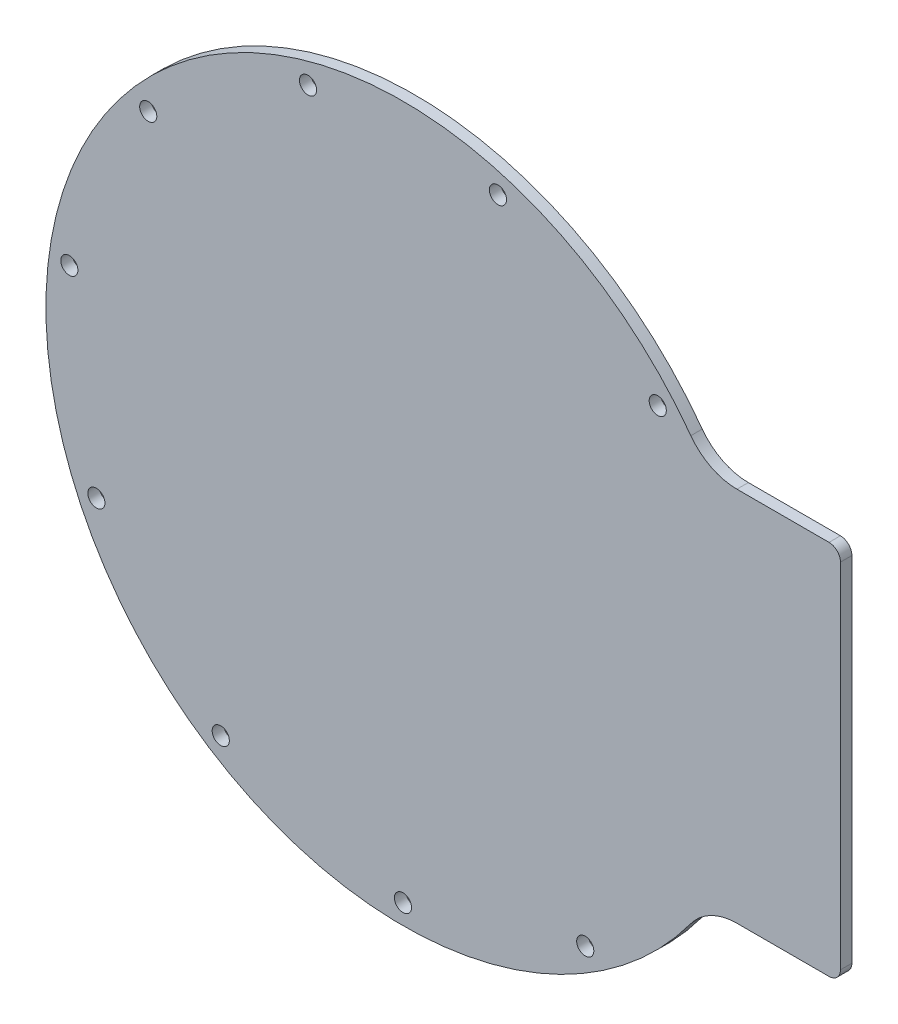
ISO-10303-21;
HEADER;
FILE_DESCRIPTION(('STEP AP214'),'2;1');
FILE_NAME('part.step','',(''),(''),'','','');
FILE_SCHEMA(('AUTOMOTIVE_DESIGN { 1 0 10303 214 1 1 1 1 }'));
ENDSEC;
DATA;
#1=APPLICATION_CONTEXT('core data for automotive mechanical design processes');
#2=APPLICATION_PROTOCOL_DEFINITION('international standard','automotive_design',2000,#1);
#3=PRODUCT_CONTEXT('',#1,'mechanical');
#4=PRODUCT('Part','Part','',(#3));
#5=PRODUCT_RELATED_PRODUCT_CATEGORY('part','',(#4));
#6=PRODUCT_DEFINITION_FORMATION('','',#4);
#7=PRODUCT_DEFINITION_CONTEXT('part definition',#1,'design');
#8=PRODUCT_DEFINITION('design','',#6,#7);
#9=PRODUCT_DEFINITION_SHAPE('','',#8);
#10=(LENGTH_UNIT() NAMED_UNIT(*) SI_UNIT(.MILLI.,.METRE.));
#11=(NAMED_UNIT(*) PLANE_ANGLE_UNIT() SI_UNIT($,.RADIAN.));
#12=(NAMED_UNIT(*) SI_UNIT($,.STERADIAN.) SOLID_ANGLE_UNIT());
#13=UNCERTAINTY_MEASURE_WITH_UNIT(LENGTH_MEASURE(1.E-05),#10,'distance_accuracy_value','');
#14=(GEOMETRIC_REPRESENTATION_CONTEXT(3) GLOBAL_UNCERTAINTY_ASSIGNED_CONTEXT((#13)) GLOBAL_UNIT_ASSIGNED_CONTEXT((#10,
#11,#12)) REPRESENTATION_CONTEXT('',''));
#15=CARTESIAN_POINT('',(0.,0.,0.));
#16=DIRECTION('',(0.,0.,1.));
#17=DIRECTION('',(1.,0.,0.));
#18=AXIS2_PLACEMENT_3D('',#15,#16,#17);
#19=CARTESIAN_POINT('',(58.44518799696,-42.9,2.));
#20=DIRECTION('',(0.,0.,1.));
#21=DIRECTION('',(1.,0.,0.));
#22=AXIS2_PLACEMENT_3D('',#19,#20,#21);
#23=PLANE('',#22);
#24=CARTESIAN_POINT('',(44.5892248869016,38.6367833027714,2.));
#25=DIRECTION('',(0.,0.,1.));
#26=DIRECTION('',(1.,0.,0.));
#27=AXIS2_PLACEMENT_3D('',#24,#25,#26);
#28=CIRCLE('',#27,1.5);
#29=CARTESIAN_POINT('',(46.0892248869016,38.6367833027714,2.));
#30=VERTEX_POINT('',#29);
#31=EDGE_CURVE('E261',#30,#30,#28,.T.);
#32=ORIENTED_EDGE('',*,*,#31,.F.);
#33=EDGE_LOOP('',(#32));
#34=FACE_BOUND('',#33,.T.);
#35=CARTESIAN_POINT('',(-16.622220853644,56.6100854432555,2.));
#36=DIRECTION('',(0.,0.,1.));
#37=DIRECTION('',(1.,0.,0.));
#38=AXIS2_PLACEMENT_3D('',#35,#36,#37);
#39=CIRCLE('',#38,1.5);
#40=CARTESIAN_POINT('',(-15.122220853644,56.6100854432555,2.));
#41=VERTEX_POINT('',#40);
#42=EDGE_CURVE('E245',#41,#41,#39,.T.);
#43=ORIENTED_EDGE('',*,*,#42,.F.);
#44=EDGE_LOOP('',(#43));
#45=FACE_BOUND('',#44,.T.);
#46=CARTESIAN_POINT('',(-58.399465070975,8.39657545812405,2.));
#47=DIRECTION('',(0.,0.,1.));
#48=DIRECTION('',(1.,0.,0.));
#49=AXIS2_PLACEMENT_3D('',#46,#47,#48);
#50=CIRCLE('',#49,1.5);
#51=CARTESIAN_POINT('',(-56.899465070975,8.39657545812405,2.));
#52=VERTEX_POINT('',#51);
#53=EDGE_CURVE('E229',#52,#52,#50,.T.);
#54=ORIENTED_EDGE('',*,*,#53,.F.);
#55=EDGE_LOOP('',(#54));
#56=FACE_BOUND('',#55,.T.);
#57=CARTESIAN_POINT('',(-31.8978082298803,-49.6339584370397,2.));
#58=DIRECTION('',(0.,0.,1.));
#59=DIRECTION('',(1.,0.,0.));
#60=AXIS2_PLACEMENT_3D('',#57,#58,#59);
#61=CIRCLE('',#60,1.5);
#62=CARTESIAN_POINT('',(-30.3978082298803,-49.6339584370397,2.));
#63=VERTEX_POINT('',#62);
#64=EDGE_CURVE('E213',#63,#63,#61,.T.);
#65=ORIENTED_EDGE('',*,*,#64,.F.);
#66=EDGE_LOOP('',(#65));
#67=FACE_BOUND('',#66,.T.);
#68=CARTESIAN_POINT('',(58.44518799696,-42.9,2.));
#69=DIRECTION('',(0.,0.,-1.));
#70=DIRECTION('',(1.,0.,0.));
#71=AXIS2_PLACEMENT_3D('',#68,#69,#70);
#72=CIRCLE('',#71,10.);
#73=CARTESIAN_POINT('',(50.383782756,-36.9827586206897,2.));
#74=VERTEX_POINT('',#73);
#75=CARTESIAN_POINT('',(58.44518799696,-32.9,2.));
#76=VERTEX_POINT('',#75);
#77=EDGE_CURVE('E164',#74,#76,#72,.T.);
#78=ORIENTED_EDGE('',*,*,#77,.T.);
#79=DIRECTION('',(1.,0.,0.));
#80=VECTOR('',#79,1.);
#81=CARTESIAN_POINT('',(58.44518799696,-32.9,2.));
#82=LINE('',#81,#80);
#83=CARTESIAN_POINT('',(74.5685,-32.9,2.));
#84=VERTEX_POINT('',#83);
#85=EDGE_CURVE('E100',#76,#84,#82,.T.);
#86=ORIENTED_EDGE('',*,*,#85,.T.);
#87=CARTESIAN_POINT('',(74.5685,-30.9,2.));
#88=DIRECTION('',(0.,0.,1.));
#89=DIRECTION('',(1.,0.,0.));
#90=AXIS2_PLACEMENT_3D('',#87,#88,#89);
#91=CIRCLE('',#90,2.);
#92=CARTESIAN_POINT('',(76.5685,-30.9,2.));
#93=VERTEX_POINT('',#92);
#94=EDGE_CURVE('E185',#84,#93,#91,.T.);
#95=ORIENTED_EDGE('',*,*,#94,.T.);
#96=DIRECTION('',(0.,1.,0.));
#97=VECTOR('',#96,1.);
#98=CARTESIAN_POINT('',(76.5685,-30.9,2.));
#99=LINE('',#98,#97);
#100=CARTESIAN_POINT('',(76.5685,30.9,2.));
#101=VERTEX_POINT('',#100);
#102=EDGE_CURVE('E199',#93,#101,#99,.T.);
#103=ORIENTED_EDGE('',*,*,#102,.T.);
#104=CARTESIAN_POINT('',(74.5685,30.9,2.));
#105=DIRECTION('',(0.,0.,1.));
#106=DIRECTION('',(-1.,0.,0.));
#107=AXIS2_PLACEMENT_3D('',#104,#105,#106);
#108=CIRCLE('',#107,2.);
#109=CARTESIAN_POINT('',(74.5685,32.9,2.));
#110=VERTEX_POINT('',#109);
#111=EDGE_CURVE('E119',#101,#110,#108,.T.);
#112=ORIENTED_EDGE('',*,*,#111,.T.);
#113=DIRECTION('',(-1.,0.,0.));
#114=VECTOR('',#113,1.);
#115=CARTESIAN_POINT('',(58.44518799696,32.9,2.));
#116=LINE('',#115,#114);
#117=CARTESIAN_POINT('',(58.44518799696,32.9,2.));
#118=VERTEX_POINT('',#117);
#119=EDGE_CURVE('E113',#110,#118,#116,.T.);
#120=ORIENTED_EDGE('',*,*,#119,.T.);
#121=CARTESIAN_POINT('',(58.44518799696,42.9,2.));
#122=DIRECTION('',(0.,0.,-1.));
#123=DIRECTION('',(-1.,0.,0.));
#124=AXIS2_PLACEMENT_3D('',#121,#122,#123);
#125=CIRCLE('',#124,10.);
#126=CARTESIAN_POINT('',(50.383782756,36.9827586206897,2.));
#127=VERTEX_POINT('',#126);
#128=EDGE_CURVE('E117',#118,#127,#125,.T.);
#129=ORIENTED_EDGE('',*,*,#128,.T.);
#130=CARTESIAN_POINT('',(0.,0.,2.));
#131=DIRECTION('',(0.,0.,1.));
#132=DIRECTION('',(1.,0.,0.));
#133=AXIS2_PLACEMENT_3D('',#130,#131,#132);
#134=CIRCLE('',#133,62.5);
#135=EDGE_CURVE('E57',#127,#74,#134,.T.);
#136=ORIENTED_EDGE('',*,*,#135,.T.);
#137=EDGE_LOOP('',(#78,#86,#95,#103,#112,#120,#129,#136));
#138=FACE_BOUND('',#137,.T.);
#139=CARTESIAN_POINT('',(0.,-59.,2.));
#140=DIRECTION('',(0.,0.,1.));
#141=DIRECTION('',(1.,0.,0.));
#142=AXIS2_PLACEMENT_3D('',#139,#140,#141);
#143=CIRCLE('',#142,1.5);
#144=CARTESIAN_POINT('',(1.5,-59.,2.));
#145=VERTEX_POINT('',#144);
#146=EDGE_CURVE('E146',#145,#145,#143,.T.);
#147=ORIENTED_EDGE('',*,*,#146,.F.);
#148=EDGE_LOOP('',(#147));
#149=FACE_BOUND('',#148,.T.);
#150=CARTESIAN_POINT('',(-53.6682877259167,-24.5094857671112,2.));
#151=DIRECTION('',(0.,0.,1.));
#152=DIRECTION('',(1.,0.,0.));
#153=AXIS2_PLACEMENT_3D('',#150,#151,#152);
#154=CIRCLE('',#153,1.5);
#155=CARTESIAN_POINT('',(-52.1682877259167,-24.5094857671112,2.));
#156=VERTEX_POINT('',#155);
#157=EDGE_CURVE('E221',#156,#156,#154,.T.);
#158=ORIENTED_EDGE('',*,*,#157,.F.);
#159=EDGE_LOOP('',(#158));
#160=FACE_BOUND('',#159,.T.);
#161=CARTESIAN_POINT('',(-44.5892248869011,38.6367833027721,2.));
#162=DIRECTION('',(0.,0.,1.));
#163=DIRECTION('',(1.,0.,0.));
#164=AXIS2_PLACEMENT_3D('',#161,#162,#163);
#165=CIRCLE('',#164,1.5);
#166=CARTESIAN_POINT('',(-43.0892248869011,38.6367833027721,2.));
#167=VERTEX_POINT('',#166);
#168=EDGE_CURVE('E237',#167,#167,#165,.T.);
#169=ORIENTED_EDGE('',*,*,#168,.F.);
#170=EDGE_LOOP('',(#169));
#171=FACE_BOUND('',#170,.T.);
#172=CARTESIAN_POINT('',(16.6222208536448,56.6100854432552,2.));
#173=DIRECTION('',(0.,0.,1.));
#174=DIRECTION('',(1.,0.,0.));
#175=AXIS2_PLACEMENT_3D('',#172,#173,#174);
#176=CIRCLE('',#175,1.5);
#177=CARTESIAN_POINT('',(18.1222208536448,56.6100854432552,2.));
#178=VERTEX_POINT('',#177);
#179=EDGE_CURVE('E253',#178,#178,#176,.T.);
#180=ORIENTED_EDGE('',*,*,#179,.F.);
#181=EDGE_LOOP('',(#180));
#182=FACE_BOUND('',#181,.T.);
#183=CARTESIAN_POINT('',(31.8978082298796,-49.6339584370401,2.));
#184=DIRECTION('',(0.,0.,1.));
#185=DIRECTION('',(1.,0.,0.));
#186=AXIS2_PLACEMENT_3D('',#183,#184,#185);
#187=CIRCLE('',#186,1.5);
#188=CARTESIAN_POINT('',(33.3978082298796,-49.6339584370401,2.));
#189=VERTEX_POINT('',#188);
#190=EDGE_CURVE('E269',#189,#189,#187,.T.);
#191=ORIENTED_EDGE('',*,*,#190,.F.);
#192=EDGE_LOOP('',(#191));
#193=FACE_BOUND('',#192,.T.);
#194=ADVANCED_FACE('F39',(#34,#45,#56,#67,#138,#149,#160,#171,#182,#193),#23,.T.);
#195=CARTESIAN_POINT('',(58.44518799696,-42.9,0.));
#196=DIRECTION('',(0.,0.,1.));
#197=DIRECTION('',(1.,0.,0.));
#198=AXIS2_PLACEMENT_3D('',#195,#196,#197);
#199=PLANE('',#198);
#200=CARTESIAN_POINT('',(58.44518799696,-42.9,0.));
#201=DIRECTION('',(0.,0.,-1.));
#202=DIRECTION('',(1.,0.,0.));
#203=AXIS2_PLACEMENT_3D('',#200,#201,#202);
#204=CIRCLE('',#203,10.);
#205=CARTESIAN_POINT('',(50.383782756,-36.9827586206897,0.));
#206=VERTEX_POINT('',#205);
#207=CARTESIAN_POINT('',(58.44518799696,-32.9,0.));
#208=VERTEX_POINT('',#207);
#209=EDGE_CURVE('E141',#206,#208,#204,.T.);
#210=ORIENTED_EDGE('',*,*,#209,.F.);
#211=CARTESIAN_POINT('',(0.,0.,0.));
#212=DIRECTION('',(0.,0.,1.));
#213=DIRECTION('',(1.,0.,0.));
#214=AXIS2_PLACEMENT_3D('',#211,#212,#213);
#215=CIRCLE('',#214,62.5);
#216=CARTESIAN_POINT('',(50.383782756,36.9827586206897,0.));
#217=VERTEX_POINT('',#216);
#218=EDGE_CURVE('E92',#217,#206,#215,.T.);
#219=ORIENTED_EDGE('',*,*,#218,.F.);
#220=CARTESIAN_POINT('',(58.44518799696,42.9,0.));
#221=DIRECTION('',(0.,0.,-1.));
#222=DIRECTION('',(-1.,0.,0.));
#223=AXIS2_PLACEMENT_3D('',#220,#221,#222);
#224=CIRCLE('',#223,10.);
#225=CARTESIAN_POINT('',(58.44518799696,32.9,0.));
#226=VERTEX_POINT('',#225);
#227=EDGE_CURVE('E86',#226,#217,#224,.T.);
#228=ORIENTED_EDGE('',*,*,#227,.F.);
#229=DIRECTION('',(-1.,0.,0.));
#230=VECTOR('',#229,1.);
#231=CARTESIAN_POINT('',(58.44518799696,32.9,0.));
#232=LINE('',#231,#230);
#233=CARTESIAN_POINT('',(74.5685,32.9,0.));
#234=VERTEX_POINT('',#233);
#235=EDGE_CURVE('E128',#234,#226,#232,.T.);
#236=ORIENTED_EDGE('',*,*,#235,.F.);
#237=CARTESIAN_POINT('',(74.5685,30.9,0.));
#238=DIRECTION('',(0.,0.,1.));
#239=DIRECTION('',(-1.,0.,0.));
#240=AXIS2_PLACEMENT_3D('',#237,#238,#239);
#241=CIRCLE('',#240,2.);
#242=CARTESIAN_POINT('',(76.5685,30.9,0.));
#243=VERTEX_POINT('',#242);
#244=EDGE_CURVE('E155',#243,#234,#241,.T.);
#245=ORIENTED_EDGE('',*,*,#244,.F.);
#246=DIRECTION('',(0.,1.,0.));
#247=VECTOR('',#246,1.);
#248=CARTESIAN_POINT('',(76.5685,-30.9,0.));
#249=LINE('',#248,#247);
#250=CARTESIAN_POINT('',(76.5685,-30.9,0.));
#251=VERTEX_POINT('',#250);
#252=EDGE_CURVE('E152',#251,#243,#249,.T.);
#253=ORIENTED_EDGE('',*,*,#252,.F.);
#254=CARTESIAN_POINT('',(74.5685,-30.9,0.));
#255=DIRECTION('',(0.,0.,1.));
#256=DIRECTION('',(1.,0.,0.));
#257=AXIS2_PLACEMENT_3D('',#254,#255,#256);
#258=CIRCLE('',#257,2.);
#259=CARTESIAN_POINT('',(74.5685,-32.9,0.));
#260=VERTEX_POINT('',#259);
#261=EDGE_CURVE('E149',#260,#251,#258,.T.);
#262=ORIENTED_EDGE('',*,*,#261,.F.);
#263=DIRECTION('',(1.,0.,0.));
#264=VECTOR('',#263,1.);
#265=CARTESIAN_POINT('',(58.44518799696,-32.9,0.));
#266=LINE('',#265,#264);
#267=EDGE_CURVE('E145',#208,#260,#266,.T.);
#268=ORIENTED_EDGE('',*,*,#267,.F.);
#269=EDGE_LOOP('',(#210,#219,#228,#236,#245,#253,#262,#268));
#270=FACE_BOUND('',#269,.T.);
#271=CARTESIAN_POINT('',(0.,-59.,0.));
#272=DIRECTION('',(0.,0.,1.));
#273=DIRECTION('',(1.,0.,0.));
#274=AXIS2_PLACEMENT_3D('',#271,#272,#273);
#275=CIRCLE('',#274,1.5);
#276=CARTESIAN_POINT('',(1.5,-59.,0.));
#277=VERTEX_POINT('',#276);
#278=EDGE_CURVE('E209',#277,#277,#275,.T.);
#279=ORIENTED_EDGE('',*,*,#278,.T.);
#280=EDGE_LOOP('',(#279));
#281=FACE_BOUND('',#280,.T.);
#282=CARTESIAN_POINT('',(-31.8978082298803,-49.6339584370397,0.));
#283=DIRECTION('',(0.,0.,1.));
#284=DIRECTION('',(1.,0.,0.));
#285=AXIS2_PLACEMENT_3D('',#282,#283,#284);
#286=CIRCLE('',#285,1.5);
#287=CARTESIAN_POINT('',(-30.3978082298803,-49.6339584370397,0.));
#288=VERTEX_POINT('',#287);
#289=EDGE_CURVE('E217',#288,#288,#286,.T.);
#290=ORIENTED_EDGE('',*,*,#289,.T.);
#291=EDGE_LOOP('',(#290));
#292=FACE_BOUND('',#291,.T.);
#293=CARTESIAN_POINT('',(-53.6682877259167,-24.5094857671112,0.));
#294=DIRECTION('',(0.,0.,1.));
#295=DIRECTION('',(1.,0.,0.));
#296=AXIS2_PLACEMENT_3D('',#293,#294,#295);
#297=CIRCLE('',#296,1.5);
#298=CARTESIAN_POINT('',(-52.1682877259167,-24.5094857671112,0.));
#299=VERTEX_POINT('',#298);
#300=EDGE_CURVE('E225',#299,#299,#297,.T.);
#301=ORIENTED_EDGE('',*,*,#300,.T.);
#302=EDGE_LOOP('',(#301));
#303=FACE_BOUND('',#302,.T.);
#304=CARTESIAN_POINT('',(-58.399465070975,8.39657545812405,0.));
#305=DIRECTION('',(0.,0.,1.));
#306=DIRECTION('',(1.,0.,0.));
#307=AXIS2_PLACEMENT_3D('',#304,#305,#306);
#308=CIRCLE('',#307,1.5);
#309=CARTESIAN_POINT('',(-56.899465070975,8.39657545812405,0.));
#310=VERTEX_POINT('',#309);
#311=EDGE_CURVE('E233',#310,#310,#308,.T.);
#312=ORIENTED_EDGE('',*,*,#311,.T.);
#313=EDGE_LOOP('',(#312));
#314=FACE_BOUND('',#313,.T.);
#315=CARTESIAN_POINT('',(-44.5892248869011,38.6367833027721,0.));
#316=DIRECTION('',(0.,0.,1.));
#317=DIRECTION('',(1.,0.,0.));
#318=AXIS2_PLACEMENT_3D('',#315,#316,#317);
#319=CIRCLE('',#318,1.5);
#320=CARTESIAN_POINT('',(-43.0892248869011,38.6367833027721,0.));
#321=VERTEX_POINT('',#320);
#322=EDGE_CURVE('E241',#321,#321,#319,.T.);
#323=ORIENTED_EDGE('',*,*,#322,.T.);
#324=EDGE_LOOP('',(#323));
#325=FACE_BOUND('',#324,.T.);
#326=CARTESIAN_POINT('',(-16.622220853644,56.6100854432555,0.));
#327=DIRECTION('',(0.,0.,1.));
#328=DIRECTION('',(1.,0.,0.));
#329=AXIS2_PLACEMENT_3D('',#326,#327,#328);
#330=CIRCLE('',#329,1.5);
#331=CARTESIAN_POINT('',(-15.122220853644,56.6100854432555,0.));
#332=VERTEX_POINT('',#331);
#333=EDGE_CURVE('E249',#332,#332,#330,.T.);
#334=ORIENTED_EDGE('',*,*,#333,.T.);
#335=EDGE_LOOP('',(#334));
#336=FACE_BOUND('',#335,.T.);
#337=CARTESIAN_POINT('',(16.6222208536448,56.6100854432552,0.));
#338=DIRECTION('',(0.,0.,1.));
#339=DIRECTION('',(1.,0.,0.));
#340=AXIS2_PLACEMENT_3D('',#337,#338,#339);
#341=CIRCLE('',#340,1.5);
#342=CARTESIAN_POINT('',(18.1222208536448,56.6100854432552,0.));
#343=VERTEX_POINT('',#342);
#344=EDGE_CURVE('E257',#343,#343,#341,.T.);
#345=ORIENTED_EDGE('',*,*,#344,.T.);
#346=EDGE_LOOP('',(#345));
#347=FACE_BOUND('',#346,.T.);
#348=CARTESIAN_POINT('',(44.5892248869016,38.6367833027714,0.));
#349=DIRECTION('',(0.,0.,1.));
#350=DIRECTION('',(1.,0.,0.));
#351=AXIS2_PLACEMENT_3D('',#348,#349,#350);
#352=CIRCLE('',#351,1.5);
#353=CARTESIAN_POINT('',(46.0892248869016,38.6367833027714,0.));
#354=VERTEX_POINT('',#353);
#355=EDGE_CURVE('E265',#354,#354,#352,.T.);
#356=ORIENTED_EDGE('',*,*,#355,.T.);
#357=EDGE_LOOP('',(#356));
#358=FACE_BOUND('',#357,.T.);
#359=CARTESIAN_POINT('',(31.8978082298796,-49.6339584370401,0.));
#360=DIRECTION('',(0.,0.,1.));
#361=DIRECTION('',(1.,0.,0.));
#362=AXIS2_PLACEMENT_3D('',#359,#360,#361);
#363=CIRCLE('',#362,1.5);
#364=CARTESIAN_POINT('',(33.3978082298796,-49.6339584370401,0.));
#365=VERTEX_POINT('',#364);
#366=EDGE_CURVE('E273',#365,#365,#363,.T.);
#367=ORIENTED_EDGE('',*,*,#366,.T.);
#368=EDGE_LOOP('',(#367));
#369=FACE_BOUND('',#368,.T.);
#370=ADVANCED_FACE('F189',(#270,#281,#292,#303,#314,#325,#336,#347,#358,#369),#199,.F.);
#371=CARTESIAN_POINT('',(58.44518799696,-42.9,2.));
#372=DIRECTION('',(0.,0.,-1.));
#373=DIRECTION('',(-1.,0.,0.));
#374=AXIS2_PLACEMENT_3D('',#371,#372,#373);
#375=CYLINDRICAL_SURFACE('',#374,10.);
#376=ORIENTED_EDGE('',*,*,#209,.T.);
#377=DIRECTION('',(0.,0.,-1.));
#378=VECTOR('',#377,1.);
#379=CARTESIAN_POINT('',(58.44518799696,-32.9,2.));
#380=LINE('',#379,#378);
#381=EDGE_CURVE('E11',#76,#208,#380,.T.);
#382=ORIENTED_EDGE('',*,*,#381,.F.);
#383=ORIENTED_EDGE('',*,*,#77,.F.);
#384=DIRECTION('',(0.,0.,-1.));
#385=VECTOR('',#384,1.);
#386=CARTESIAN_POINT('',(50.383782756,-36.9827586206897,2.));
#387=LINE('',#386,#385);
#388=EDGE_CURVE('E137',#74,#206,#387,.T.);
#389=ORIENTED_EDGE('',*,*,#388,.T.);
#390=EDGE_LOOP('',(#376,#382,#383,#389));
#391=FACE_BOUND('',#390,.T.);
#392=ADVANCED_FACE('F41',(#391),#375,.F.);
#393=CARTESIAN_POINT('',(58.44518799696,-32.9,2.));
#394=DIRECTION('',(0.,1.,0.));
#395=DIRECTION('',(-1.,0.,0.));
#396=AXIS2_PLACEMENT_3D('',#393,#394,#395);
#397=PLANE('',#396);
#398=ORIENTED_EDGE('',*,*,#267,.T.);
#399=DIRECTION('',(0.,0.,-1.));
#400=VECTOR('',#399,1.);
#401=CARTESIAN_POINT('',(74.5685,-32.9,2.));
#402=LINE('',#401,#400);
#403=EDGE_CURVE('E49',#84,#260,#402,.T.);
#404=ORIENTED_EDGE('',*,*,#403,.F.);
#405=ORIENTED_EDGE('',*,*,#85,.F.);
#406=ORIENTED_EDGE('',*,*,#381,.T.);
#407=EDGE_LOOP('',(#398,#404,#405,#406));
#408=FACE_BOUND('',#407,.T.);
#409=ADVANCED_FACE('F309',(#408),#397,.F.);
#410=CARTESIAN_POINT('',(74.5685,-30.9,2.));
#411=DIRECTION('',(0.,0.,-1.));
#412=DIRECTION('',(-1.,0.,0.));
#413=AXIS2_PLACEMENT_3D('',#410,#411,#412);
#414=CYLINDRICAL_SURFACE('',#413,2.);
#415=ORIENTED_EDGE('',*,*,#261,.T.);
#416=DIRECTION('',(0.,0.,-1.));
#417=VECTOR('',#416,1.);
#418=CARTESIAN_POINT('',(76.5685,-30.9,2.));
#419=LINE('',#418,#417);
#420=EDGE_CURVE('E175',#93,#251,#419,.T.);
#421=ORIENTED_EDGE('',*,*,#420,.F.);
#422=ORIENTED_EDGE('',*,*,#94,.F.);
#423=ORIENTED_EDGE('',*,*,#403,.T.);
#424=EDGE_LOOP('',(#415,#421,#422,#423));
#425=FACE_BOUND('',#424,.T.);
#426=ADVANCED_FACE('F183',(#425),#414,.T.);
#427=CARTESIAN_POINT('',(76.5685,-30.9,2.));
#428=DIRECTION('',(-1.,0.,0.));
#429=DIRECTION('',(0.,0.,1.));
#430=AXIS2_PLACEMENT_3D('',#427,#428,#429);
#431=PLANE('',#430);
#432=ORIENTED_EDGE('',*,*,#252,.T.);
#433=DIRECTION('',(0.,0.,-1.));
#434=VECTOR('',#433,1.);
#435=CARTESIAN_POINT('',(76.5685,30.9,2.));
#436=LINE('',#435,#434);
#437=EDGE_CURVE('E171',#101,#243,#436,.T.);
#438=ORIENTED_EDGE('',*,*,#437,.F.);
#439=ORIENTED_EDGE('',*,*,#102,.F.);
#440=ORIENTED_EDGE('',*,*,#420,.T.);
#441=EDGE_LOOP('',(#432,#438,#439,#440));
#442=FACE_BOUND('',#441,.T.);
#443=ADVANCED_FACE('F194',(#442),#431,.F.);
#444=CARTESIAN_POINT('',(74.5685,30.9,2.));
#445=DIRECTION('',(0.,0.,-1.));
#446=DIRECTION('',(-1.,0.,0.));
#447=AXIS2_PLACEMENT_3D('',#444,#445,#446);
#448=CYLINDRICAL_SURFACE('',#447,2.);
#449=ORIENTED_EDGE('',*,*,#244,.T.);
#450=DIRECTION('',(0.,0.,-1.));
#451=VECTOR('',#450,1.);
#452=CARTESIAN_POINT('',(74.5685,32.9,2.));
#453=LINE('',#452,#451);
#454=EDGE_CURVE('E130',#110,#234,#453,.T.);
#455=ORIENTED_EDGE('',*,*,#454,.F.);
#456=ORIENTED_EDGE('',*,*,#111,.F.);
#457=ORIENTED_EDGE('',*,*,#437,.T.);
#458=EDGE_LOOP('',(#449,#455,#456,#457));
#459=FACE_BOUND('',#458,.T.);
#460=ADVANCED_FACE('F197',(#459),#448,.T.);
#461=CARTESIAN_POINT('',(58.44518799696,32.9,2.));
#462=DIRECTION('',(0.,-1.,0.));
#463=DIRECTION('',(0.,0.,-1.));
#464=AXIS2_PLACEMENT_3D('',#461,#462,#463);
#465=PLANE('',#464);
#466=ORIENTED_EDGE('',*,*,#235,.T.);
#467=DIRECTION('',(0.,0.,-1.));
#468=VECTOR('',#467,1.);
#469=CARTESIAN_POINT('',(58.44518799696,32.9,2.));
#470=LINE('',#469,#468);
#471=EDGE_CURVE('E125',#118,#226,#470,.T.);
#472=ORIENTED_EDGE('',*,*,#471,.F.);
#473=ORIENTED_EDGE('',*,*,#119,.F.);
#474=ORIENTED_EDGE('',*,*,#454,.T.);
#475=EDGE_LOOP('',(#466,#472,#473,#474));
#476=FACE_BOUND('',#475,.T.);
#477=ADVANCED_FACE('F126',(#476),#465,.F.);
#478=CARTESIAN_POINT('',(58.44518799696,42.9,2.));
#479=DIRECTION('',(0.,0.,-1.));
#480=DIRECTION('',(-1.,0.,0.));
#481=AXIS2_PLACEMENT_3D('',#478,#479,#480);
#482=CYLINDRICAL_SURFACE('',#481,10.);
#483=ORIENTED_EDGE('',*,*,#227,.T.);
#484=DIRECTION('',(0.,0.,-1.));
#485=VECTOR('',#484,1.);
#486=CARTESIAN_POINT('',(50.383782756,36.9827586206897,2.));
#487=LINE('',#486,#485);
#488=EDGE_CURVE('E131',#127,#217,#487,.T.);
#489=ORIENTED_EDGE('',*,*,#488,.F.);
#490=ORIENTED_EDGE('',*,*,#128,.F.);
#491=ORIENTED_EDGE('',*,*,#471,.T.);
#492=EDGE_LOOP('',(#483,#489,#490,#491));
#493=FACE_BOUND('',#492,.T.);
#494=ADVANCED_FACE('F133',(#493),#482,.F.);
#495=CARTESIAN_POINT('',(0.,0.,2.));
#496=DIRECTION('',(0.,0.,-1.));
#497=DIRECTION('',(-1.,0.,0.));
#498=AXIS2_PLACEMENT_3D('',#495,#496,#497);
#499=CYLINDRICAL_SURFACE('',#498,62.5);
#500=ORIENTED_EDGE('',*,*,#218,.T.);
#501=ORIENTED_EDGE('',*,*,#388,.F.);
#502=ORIENTED_EDGE('',*,*,#135,.F.);
#503=ORIENTED_EDGE('',*,*,#488,.T.);
#504=EDGE_LOOP('',(#500,#501,#502,#503));
#505=FACE_BOUND('',#504,.T.);
#506=ADVANCED_FACE('F297',(#505),#499,.T.);
#507=CARTESIAN_POINT('',(0.,-59.,2.));
#508=DIRECTION('',(0.,0.,-1.));
#509=DIRECTION('',(-1.,0.,0.));
#510=AXIS2_PLACEMENT_3D('',#507,#508,#509);
#511=CYLINDRICAL_SURFACE('',#510,1.5);
#512=ORIENTED_EDGE('',*,*,#146,.T.);
#513=EDGE_LOOP('',(#512));
#514=FACE_BOUND('',#513,.T.);
#515=ORIENTED_EDGE('',*,*,#278,.F.);
#516=EDGE_LOOP('',(#515));
#517=FACE_BOUND('',#516,.T.);
#518=ADVANCED_FACE('F294',(#514,#517),#511,.F.);
#519=CARTESIAN_POINT('',(-31.8978082298803,-49.6339584370397,2.));
#520=DIRECTION('',(0.,0.,-1.));
#521=DIRECTION('',(-1.,0.,0.));
#522=AXIS2_PLACEMENT_3D('',#519,#520,#521);
#523=CYLINDRICAL_SURFACE('',#522,1.5);
#524=ORIENTED_EDGE('',*,*,#64,.T.);
#525=EDGE_LOOP('',(#524));
#526=FACE_BOUND('',#525,.T.);
#527=ORIENTED_EDGE('',*,*,#289,.F.);
#528=EDGE_LOOP('',(#527));
#529=FACE_BOUND('',#528,.T.);
#530=ADVANCED_FACE('F373',(#526,#529),#523,.F.);
#531=CARTESIAN_POINT('',(-53.6682877259167,-24.5094857671112,2.));
#532=DIRECTION('',(0.,0.,-1.));
#533=DIRECTION('',(-1.,0.,0.));
#534=AXIS2_PLACEMENT_3D('',#531,#532,#533);
#535=CYLINDRICAL_SURFACE('',#534,1.5);
#536=ORIENTED_EDGE('',*,*,#157,.T.);
#537=EDGE_LOOP('',(#536));
#538=FACE_BOUND('',#537,.T.);
#539=ORIENTED_EDGE('',*,*,#300,.F.);
#540=EDGE_LOOP('',(#539));
#541=FACE_BOUND('',#540,.T.);
#542=ADVANCED_FACE('F381',(#538,#541),#535,.F.);
#543=CARTESIAN_POINT('',(-58.399465070975,8.39657545812405,2.));
#544=DIRECTION('',(0.,0.,-1.));
#545=DIRECTION('',(-1.,0.,0.));
#546=AXIS2_PLACEMENT_3D('',#543,#544,#545);
#547=CYLINDRICAL_SURFACE('',#546,1.5);
#548=ORIENTED_EDGE('',*,*,#53,.T.);
#549=EDGE_LOOP('',(#548));
#550=FACE_BOUND('',#549,.T.);
#551=ORIENTED_EDGE('',*,*,#311,.F.);
#552=EDGE_LOOP('',(#551));
#553=FACE_BOUND('',#552,.T.);
#554=ADVANCED_FACE('F389',(#550,#553),#547,.F.);
#555=CARTESIAN_POINT('',(-44.5892248869011,38.6367833027721,2.));
#556=DIRECTION('',(0.,0.,-1.));
#557=DIRECTION('',(-1.,0.,0.));
#558=AXIS2_PLACEMENT_3D('',#555,#556,#557);
#559=CYLINDRICAL_SURFACE('',#558,1.5);
#560=ORIENTED_EDGE('',*,*,#168,.T.);
#561=EDGE_LOOP('',(#560));
#562=FACE_BOUND('',#561,.T.);
#563=ORIENTED_EDGE('',*,*,#322,.F.);
#564=EDGE_LOOP('',(#563));
#565=FACE_BOUND('',#564,.T.);
#566=ADVANCED_FACE('F398',(#562,#565),#559,.F.);
#567=CARTESIAN_POINT('',(-16.622220853644,56.6100854432555,2.));
#568=DIRECTION('',(0.,0.,-1.));
#569=DIRECTION('',(-1.,0.,0.));
#570=AXIS2_PLACEMENT_3D('',#567,#568,#569);
#571=CYLINDRICAL_SURFACE('',#570,1.5);
#572=ORIENTED_EDGE('',*,*,#42,.T.);
#573=EDGE_LOOP('',(#572));
#574=FACE_BOUND('',#573,.T.);
#575=ORIENTED_EDGE('',*,*,#333,.F.);
#576=EDGE_LOOP('',(#575));
#577=FACE_BOUND('',#576,.T.);
#578=ADVANCED_FACE('F407',(#574,#577),#571,.F.);
#579=CARTESIAN_POINT('',(16.6222208536448,56.6100854432552,2.));
#580=DIRECTION('',(0.,0.,-1.));
#581=DIRECTION('',(-1.,0.,0.));
#582=AXIS2_PLACEMENT_3D('',#579,#580,#581);
#583=CYLINDRICAL_SURFACE('',#582,1.5);
#584=ORIENTED_EDGE('',*,*,#179,.T.);
#585=EDGE_LOOP('',(#584));
#586=FACE_BOUND('',#585,.T.);
#587=ORIENTED_EDGE('',*,*,#344,.F.);
#588=EDGE_LOOP('',(#587));
#589=FACE_BOUND('',#588,.T.);
#590=ADVANCED_FACE('F416',(#586,#589),#583,.F.);
#591=CARTESIAN_POINT('',(44.5892248869016,38.6367833027714,2.));
#592=DIRECTION('',(0.,0.,-1.));
#593=DIRECTION('',(-1.,0.,0.));
#594=AXIS2_PLACEMENT_3D('',#591,#592,#593);
#595=CYLINDRICAL_SURFACE('',#594,1.5);
#596=ORIENTED_EDGE('',*,*,#31,.T.);
#597=EDGE_LOOP('',(#596));
#598=FACE_BOUND('',#597,.T.);
#599=ORIENTED_EDGE('',*,*,#355,.F.);
#600=EDGE_LOOP('',(#599));
#601=FACE_BOUND('',#600,.T.);
#602=ADVANCED_FACE('F425',(#598,#601),#595,.F.);
#603=CARTESIAN_POINT('',(31.8978082298796,-49.6339584370401,2.));
#604=DIRECTION('',(0.,0.,-1.));
#605=DIRECTION('',(-1.,0.,0.));
#606=AXIS2_PLACEMENT_3D('',#603,#604,#605);
#607=CYLINDRICAL_SURFACE('',#606,1.5);
#608=ORIENTED_EDGE('',*,*,#190,.T.);
#609=EDGE_LOOP('',(#608));
#610=FACE_BOUND('',#609,.T.);
#611=ORIENTED_EDGE('',*,*,#366,.F.);
#612=EDGE_LOOP('',(#611));
#613=FACE_BOUND('',#612,.T.);
#614=ADVANCED_FACE('F281',(#610,#613),#607,.F.);
#615=CLOSED_SHELL('',(#194,#370,#392,#409,#426,#443,#460,#477,#494,#506,#518,#530,#542,#554,
#566,#578,#590,#602,#614));
#616=MANIFOLD_SOLID_BREP('B2',#615);
#617=ADVANCED_BREP_SHAPE_REPRESENTATION('',(#18,#616),#14);
#618=SHAPE_DEFINITION_REPRESENTATION(#9,#617);
ENDSEC;
END-ISO-10303-21;
